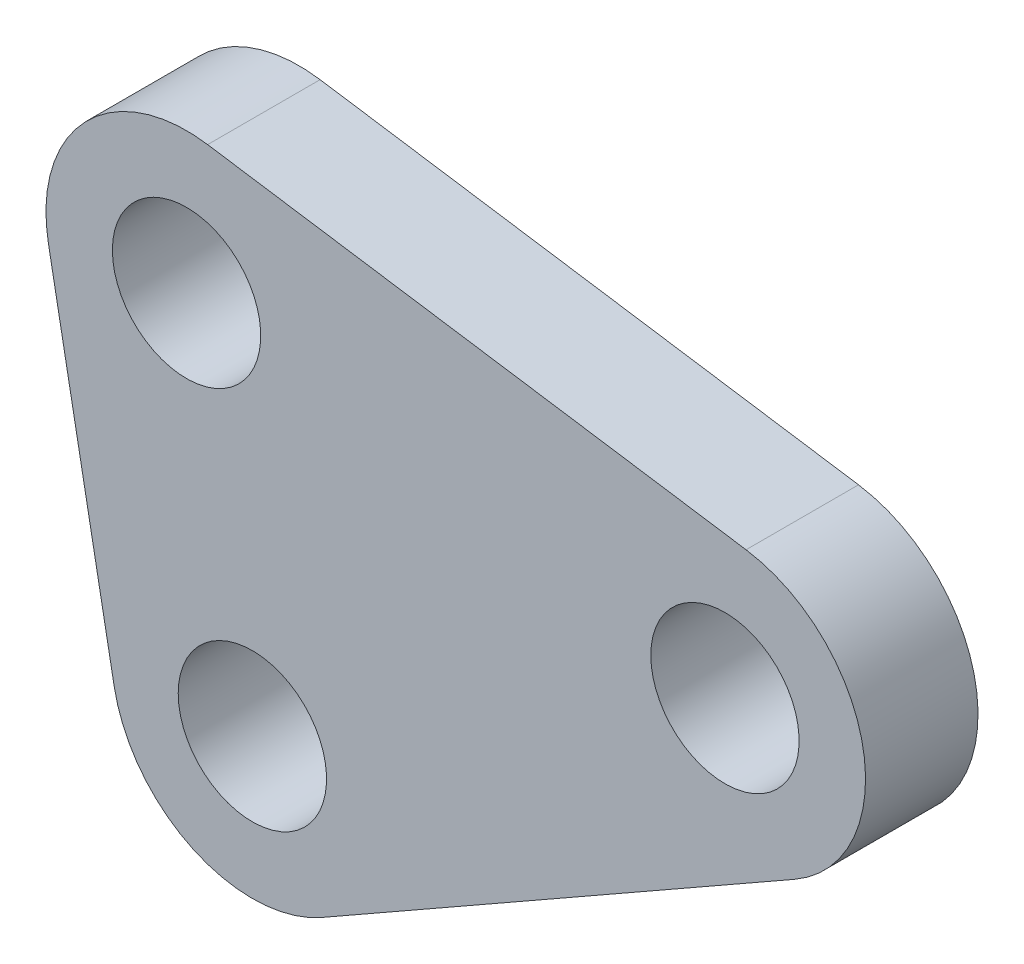
ISO-10303-21;
HEADER;
FILE_DESCRIPTION(('STEP AP214'),'2;1');
FILE_NAME('part.step','',(''),(''),'','','');
FILE_SCHEMA(('AUTOMOTIVE_DESIGN { 1 0 10303 214 1 1 1 1 }'));
ENDSEC;
DATA;
#1=APPLICATION_CONTEXT('core data for automotive mechanical design processes');
#2=APPLICATION_PROTOCOL_DEFINITION('international standard','automotive_design',2000,#1);
#3=PRODUCT_CONTEXT('',#1,'mechanical');
#4=PRODUCT('Part','Part','',(#3));
#5=PRODUCT_RELATED_PRODUCT_CATEGORY('part','',(#4));
#6=PRODUCT_DEFINITION_FORMATION('','',#4);
#7=PRODUCT_DEFINITION_CONTEXT('part definition',#1,'design');
#8=PRODUCT_DEFINITION('design','',#6,#7);
#9=PRODUCT_DEFINITION_SHAPE('','',#8);
#10=(LENGTH_UNIT() NAMED_UNIT(*) SI_UNIT(.MILLI.,.METRE.));
#11=(NAMED_UNIT(*) PLANE_ANGLE_UNIT() SI_UNIT($,.RADIAN.));
#12=(NAMED_UNIT(*) SI_UNIT($,.STERADIAN.) SOLID_ANGLE_UNIT());
#13=UNCERTAINTY_MEASURE_WITH_UNIT(LENGTH_MEASURE(1.E-05),#10,'distance_accuracy_value','');
#14=(GEOMETRIC_REPRESENTATION_CONTEXT(3) GLOBAL_UNCERTAINTY_ASSIGNED_CONTEXT((#13)) GLOBAL_UNIT_ASSIGNED_CONTEXT((#10,
#11,#12)) REPRESENTATION_CONTEXT('',''));
#15=CARTESIAN_POINT('',(0.,0.,0.));
#16=DIRECTION('',(0.,0.,1.));
#17=DIRECTION('',(1.,0.,0.));
#18=AXIS2_PLACEMENT_3D('',#15,#16,#17);
#19=CARTESIAN_POINT('',(45.2881051723479,69.194775027858,0.));
#20=DIRECTION('',(0.,0.,1.));
#21=DIRECTION('',(1.,0.,0.));
#22=AXIS2_PLACEMENT_3D('',#19,#20,#21);
#23=CYLINDRICAL_SURFACE('',#22,5.00000000000001);
#24=CARTESIAN_POINT('',(45.2881051723479,69.194775027858,4.));
#25=DIRECTION('',(0.,0.,1.));
#26=DIRECTION('',(1.,0.,0.));
#27=AXIS2_PLACEMENT_3D('',#24,#25,#26);
#28=CIRCLE('',#27,5.00000000000001);
#29=CARTESIAN_POINT('',(47.7635886864171,64.8505856475972,4.));
#30=VERTEX_POINT('',#29);
#31=CARTESIAN_POINT('',(46.0379881850551,74.1382227586683,4.));
#32=VERTEX_POINT('',#31);
#33=EDGE_CURVE('E120',#30,#32,#28,.T.);
#34=ORIENTED_EDGE('',*,*,#33,.F.);
#35=DIRECTION('',(0.,0.,1.));
#36=VECTOR('',#35,1.);
#37=CARTESIAN_POINT('',(47.7635886864171,64.8505856475972,0.));
#38=LINE('',#37,#36);
#39=CARTESIAN_POINT('',(47.7635886864171,64.8505856475972,0.));
#40=VERTEX_POINT('',#39);
#41=EDGE_CURVE('E11',#40,#30,#38,.T.);
#42=ORIENTED_EDGE('',*,*,#41,.F.);
#43=CARTESIAN_POINT('',(45.2881051723479,69.194775027858,0.));
#44=DIRECTION('',(0.,0.,1.));
#45=DIRECTION('',(1.,0.,0.));
#46=AXIS2_PLACEMENT_3D('',#43,#44,#45);
#47=CIRCLE('',#46,5.00000000000001);
#48=CARTESIAN_POINT('',(46.0379881850551,74.1382227586683,0.));
#49=VERTEX_POINT('',#48);
#50=EDGE_CURVE('E135',#40,#49,#47,.T.);
#51=ORIENTED_EDGE('',*,*,#50,.T.);
#52=DIRECTION('',(0.,0.,1.));
#53=VECTOR('',#52,1.);
#54=CARTESIAN_POINT('',(46.0379881850551,74.1382227586683,0.));
#55=LINE('',#54,#53);
#56=EDGE_CURVE('E38',#49,#32,#55,.T.);
#57=ORIENTED_EDGE('',*,*,#56,.T.);
#58=EDGE_LOOP('',(#34,#42,#51,#57));
#59=FACE_BOUND('',#58,.T.);
#60=ADVANCED_FACE('F35',(#59),#23,.T.);
#61=CARTESIAN_POINT('',(30.9580435209812,55.2741500089913,0.));
#62=DIRECTION('',(0.495096702813856,-0.868837876052171,0.));
#63=DIRECTION('',(0.868837876052171,0.495096702813856,0.));
#64=AXIS2_PLACEMENT_3D('',#61,#62,#63);
#65=PLANE('',#64);
#66=DIRECTION('',(0.868837876052171,0.495096702813856,0.));
#67=VECTOR('',#66,1.);
#68=CARTESIAN_POINT('',(30.9580435209812,55.2741500089913,4.));
#69=LINE('',#68,#67);
#70=CARTESIAN_POINT('',(30.9580435209812,55.2741500089913,4.));
#71=VERTEX_POINT('',#70);
#72=EDGE_CURVE('E133',#71,#30,#69,.T.);
#73=ORIENTED_EDGE('',*,*,#72,.F.);
#74=DIRECTION('',(0.,0.,1.));
#75=VECTOR('',#74,1.);
#76=CARTESIAN_POINT('',(30.9580435209812,55.2741500089913,0.));
#77=LINE('',#76,#75);
#78=CARTESIAN_POINT('',(30.9580435209812,55.2741500089913,0.));
#79=VERTEX_POINT('',#78);
#80=EDGE_CURVE('E44',#79,#71,#77,.T.);
#81=ORIENTED_EDGE('',*,*,#80,.F.);
#82=DIRECTION('',(0.868837876052171,0.495096702813856,0.));
#83=VECTOR('',#82,1.);
#84=CARTESIAN_POINT('',(30.9580435209812,55.2741500089913,0.));
#85=LINE('',#84,#83);
#86=EDGE_CURVE('E110',#79,#40,#85,.T.);
#87=ORIENTED_EDGE('',*,*,#86,.T.);
#88=ORIENTED_EDGE('',*,*,#41,.T.);
#89=EDGE_LOOP('',(#73,#81,#87,#88));
#90=FACE_BOUND('',#89,.T.);
#91=ADVANCED_FACE('F143',(#90),#65,.T.);
#92=CARTESIAN_POINT('',(28.4825600069119,59.6183393892521,0.));
#93=DIRECTION('',(0.,0.,1.));
#94=DIRECTION('',(1.,0.,0.));
#95=AXIS2_PLACEMENT_3D('',#92,#93,#94);
#96=CYLINDRICAL_SURFACE('',#95,4.99999999999993);
#97=CARTESIAN_POINT('',(28.4825600069119,59.6183393892521,4.));
#98=DIRECTION('',(0.,0.,1.));
#99=DIRECTION('',(1.,0.,0.));
#100=AXIS2_PLACEMENT_3D('',#97,#98,#99);
#101=CIRCLE('',#100,4.99999999999993);
#102=CARTESIAN_POINT('',(23.5682492589573,58.6966290917417,4.));
#103=VERTEX_POINT('',#102);
#104=EDGE_CURVE('E97',#103,#71,#101,.T.);
#105=ORIENTED_EDGE('',*,*,#104,.F.);
#106=DIRECTION('',(0.,0.,1.));
#107=VECTOR('',#106,1.);
#108=CARTESIAN_POINT('',(23.5682492589573,58.6966290917417,0.));
#109=LINE('',#108,#107);
#110=CARTESIAN_POINT('',(23.5682492589573,58.6966290917417,0.));
#111=VERTEX_POINT('',#110);
#112=EDGE_CURVE('E92',#111,#103,#109,.T.);
#113=ORIENTED_EDGE('',*,*,#112,.F.);
#114=CARTESIAN_POINT('',(28.4825600069119,59.6183393892521,0.));
#115=DIRECTION('',(0.,0.,1.));
#116=DIRECTION('',(1.,0.,0.));
#117=AXIS2_PLACEMENT_3D('',#114,#115,#116);
#118=CIRCLE('',#117,4.99999999999993);
#119=EDGE_CURVE('E95',#111,#79,#118,.T.);
#120=ORIENTED_EDGE('',*,*,#119,.T.);
#121=ORIENTED_EDGE('',*,*,#80,.T.);
#122=EDGE_LOOP('',(#105,#113,#120,#121));
#123=FACE_BOUND('',#122,.T.);
#124=ADVANCED_FACE('F94',(#123),#96,.T.);
#125=CARTESIAN_POINT('',(21.227396240506,71.1774261263712,0.));
#126=DIRECTION('',(-0.982862149590939,-0.184342059502107,0.));
#127=DIRECTION('',(0.184342059502107,-0.982862149590939,0.));
#128=AXIS2_PLACEMENT_3D('',#125,#126,#127);
#129=PLANE('',#128);
#130=DIRECTION('',(0.184342059502107,-0.982862149590939,0.));
#131=VECTOR('',#130,1.);
#132=CARTESIAN_POINT('',(21.227396240506,71.1774261263712,4.));
#133=LINE('',#132,#131);
#134=CARTESIAN_POINT('',(21.227396240506,71.1774261263712,4.));
#135=VERTEX_POINT('',#134);
#136=EDGE_CURVE('E130',#135,#103,#133,.T.);
#137=ORIENTED_EDGE('',*,*,#136,.F.);
#138=DIRECTION('',(0.,0.,1.));
#139=VECTOR('',#138,1.);
#140=CARTESIAN_POINT('',(21.227396240506,71.1774261263712,0.));
#141=LINE('',#140,#139);
#142=CARTESIAN_POINT('',(21.227396240506,71.1774261263712,0.));
#143=VERTEX_POINT('',#142);
#144=EDGE_CURVE('E102',#143,#135,#141,.T.);
#145=ORIENTED_EDGE('',*,*,#144,.F.);
#146=DIRECTION('',(0.184342059502107,-0.982862149590939,0.));
#147=VECTOR('',#146,1.);
#148=CARTESIAN_POINT('',(21.227396240506,71.1774261263712,0.));
#149=LINE('',#148,#147);
#150=EDGE_CURVE('E108',#143,#111,#149,.T.);
#151=ORIENTED_EDGE('',*,*,#150,.T.);
#152=ORIENTED_EDGE('',*,*,#112,.T.);
#153=EDGE_LOOP('',(#137,#145,#151,#152));
#154=FACE_BOUND('',#153,.T.);
#155=ADVANCED_FACE('F112',(#154),#129,.T.);
#156=CARTESIAN_POINT('',(26.1417069884607,72.0991364238817,0.));
#157=DIRECTION('',(0.,0.,1.));
#158=DIRECTION('',(1.,0.,0.));
#159=AXIS2_PLACEMENT_3D('',#156,#157,#158);
#160=CYLINDRICAL_SURFACE('',#159,5.);
#161=CARTESIAN_POINT('',(26.1417069884607,72.0991364238817,4.));
#162=DIRECTION('',(0.,0.,1.));
#163=DIRECTION('',(1.,0.,0.));
#164=AXIS2_PLACEMENT_3D('',#161,#162,#163);
#165=CIRCLE('',#164,5.);
#166=CARTESIAN_POINT('',(26.891590001168,77.042584154692,4.));
#167=VERTEX_POINT('',#166);
#168=EDGE_CURVE('E127',#167,#135,#165,.T.);
#169=ORIENTED_EDGE('',*,*,#168,.F.);
#170=DIRECTION('',(0.,0.,1.));
#171=VECTOR('',#170,1.);
#172=CARTESIAN_POINT('',(26.891590001168,77.042584154692,0.));
#173=LINE('',#172,#171);
#174=CARTESIAN_POINT('',(26.891590001168,77.042584154692,0.));
#175=VERTEX_POINT('',#174);
#176=EDGE_CURVE('E138',#175,#167,#173,.T.);
#177=ORIENTED_EDGE('',*,*,#176,.F.);
#178=CARTESIAN_POINT('',(26.1417069884607,72.0991364238817,0.));
#179=DIRECTION('',(0.,0.,1.));
#180=DIRECTION('',(1.,0.,0.));
#181=AXIS2_PLACEMENT_3D('',#178,#179,#180);
#182=CIRCLE('',#181,5.);
#183=EDGE_CURVE('E113',#175,#143,#182,.T.);
#184=ORIENTED_EDGE('',*,*,#183,.T.);
#185=ORIENTED_EDGE('',*,*,#144,.T.);
#186=EDGE_LOOP('',(#169,#177,#184,#185));
#187=FACE_BOUND('',#186,.T.);
#188=ADVANCED_FACE('F156',(#187),#160,.T.);
#189=CARTESIAN_POINT('',(46.0379881850551,74.1382227586683,0.));
#190=DIRECTION('',(0.14997660254145,0.988689546162052,0.));
#191=DIRECTION('',(-0.988689546162052,0.14997660254145,0.));
#192=AXIS2_PLACEMENT_3D('',#189,#190,#191);
#193=PLANE('',#192);
#194=DIRECTION('',(-0.988689546162052,0.14997660254145,0.));
#195=VECTOR('',#194,1.);
#196=CARTESIAN_POINT('',(46.0379881850551,74.1382227586683,4.));
#197=LINE('',#196,#195);
#198=EDGE_CURVE('E123',#32,#167,#197,.T.);
#199=ORIENTED_EDGE('',*,*,#198,.F.);
#200=ORIENTED_EDGE('',*,*,#56,.F.);
#201=DIRECTION('',(-0.988689546162052,0.14997660254145,0.));
#202=VECTOR('',#201,1.);
#203=CARTESIAN_POINT('',(46.0379881850551,74.1382227586683,0.));
#204=LINE('',#203,#202);
#205=EDGE_CURVE('E115',#49,#175,#204,.T.);
#206=ORIENTED_EDGE('',*,*,#205,.T.);
#207=ORIENTED_EDGE('',*,*,#176,.T.);
#208=EDGE_LOOP('',(#199,#200,#206,#207));
#209=FACE_BOUND('',#208,.T.);
#210=ADVANCED_FACE('F140',(#209),#193,.T.);
#211=CARTESIAN_POINT('',(45.2881051723479,69.194775027858,0.));
#212=DIRECTION('',(0.,0.,1.));
#213=DIRECTION('',(1.,0.,0.));
#214=AXIS2_PLACEMENT_3D('',#211,#212,#213);
#215=PLANE('',#214);
#216=CARTESIAN_POINT('',(28.4825600069119,59.6183393892521,0.));
#217=DIRECTION('',(0.,0.,1.));
#218=DIRECTION('',(-1.,0.,0.));
#219=AXIS2_PLACEMENT_3D('',#216,#217,#218);
#220=CIRCLE('',#219,2.6375);
#221=CARTESIAN_POINT('',(25.8450600069119,59.6183393892521,0.));
#222=VERTEX_POINT('',#221);
#223=EDGE_CURVE('E186',#222,#222,#220,.T.);
#224=ORIENTED_EDGE('',*,*,#223,.T.);
#225=EDGE_LOOP('',(#224));
#226=FACE_BOUND('',#225,.T.);
#227=CARTESIAN_POINT('',(26.1417069884607,72.0991364238817,0.));
#228=DIRECTION('',(0.,0.,1.));
#229=DIRECTION('',(-1.,0.,0.));
#230=AXIS2_PLACEMENT_3D('',#227,#228,#229);
#231=CIRCLE('',#230,2.6375);
#232=CARTESIAN_POINT('',(23.5042069884607,72.0991364238817,0.));
#233=VERTEX_POINT('',#232);
#234=EDGE_CURVE('E194',#233,#233,#231,.T.);
#235=ORIENTED_EDGE('',*,*,#234,.T.);
#236=EDGE_LOOP('',(#235));
#237=FACE_BOUND('',#236,.T.);
#238=CARTESIAN_POINT('',(45.2881051723479,69.194775027858,0.));
#239=DIRECTION('',(0.,0.,1.));
#240=DIRECTION('',(-1.,0.,0.));
#241=AXIS2_PLACEMENT_3D('',#238,#239,#240);
#242=CIRCLE('',#241,2.6375);
#243=CARTESIAN_POINT('',(42.6506051723479,69.194775027858,0.));
#244=VERTEX_POINT('',#243);
#245=EDGE_CURVE('E124',#244,#244,#242,.T.);
#246=ORIENTED_EDGE('',*,*,#245,.T.);
#247=EDGE_LOOP('',(#246));
#248=FACE_BOUND('',#247,.T.);
#249=ORIENTED_EDGE('',*,*,#50,.F.);
#250=ORIENTED_EDGE('',*,*,#86,.F.);
#251=ORIENTED_EDGE('',*,*,#119,.F.);
#252=ORIENTED_EDGE('',*,*,#150,.F.);
#253=ORIENTED_EDGE('',*,*,#183,.F.);
#254=ORIENTED_EDGE('',*,*,#205,.F.);
#255=EDGE_LOOP('',(#249,#250,#251,#252,#253,#254));
#256=FACE_BOUND('',#255,.T.);
#257=ADVANCED_FACE('F106',(#226,#237,#248,#256),#215,.F.);
#258=CARTESIAN_POINT('',(45.2881051723479,69.194775027858,4.));
#259=DIRECTION('',(0.,0.,1.));
#260=DIRECTION('',(1.,0.,0.));
#261=AXIS2_PLACEMENT_3D('',#258,#259,#260);
#262=PLANE('',#261);
#263=CARTESIAN_POINT('',(28.4825600069119,59.6183393892521,4.));
#264=DIRECTION('',(0.,0.,1.));
#265=DIRECTION('',(-1.,0.,0.));
#266=AXIS2_PLACEMENT_3D('',#263,#264,#265);
#267=CIRCLE('',#266,2.6375);
#268=CARTESIAN_POINT('',(25.8450600069119,59.6183393892521,4.));
#269=VERTEX_POINT('',#268);
#270=EDGE_CURVE('E189',#269,#269,#267,.T.);
#271=ORIENTED_EDGE('',*,*,#270,.F.);
#272=EDGE_LOOP('',(#271));
#273=FACE_BOUND('',#272,.T.);
#274=CARTESIAN_POINT('',(26.1417069884607,72.0991364238817,4.));
#275=DIRECTION('',(0.,0.,1.));
#276=DIRECTION('',(-1.,0.,0.));
#277=AXIS2_PLACEMENT_3D('',#274,#275,#276);
#278=CIRCLE('',#277,2.6375);
#279=CARTESIAN_POINT('',(23.5042069884607,72.0991364238817,4.));
#280=VERTEX_POINT('',#279);
#281=EDGE_CURVE('E191',#280,#280,#278,.T.);
#282=ORIENTED_EDGE('',*,*,#281,.F.);
#283=EDGE_LOOP('',(#282));
#284=FACE_BOUND('',#283,.T.);
#285=CARTESIAN_POINT('',(45.2881051723479,69.194775027858,4.));
#286=DIRECTION('',(0.,0.,1.));
#287=DIRECTION('',(-1.,0.,0.));
#288=AXIS2_PLACEMENT_3D('',#285,#286,#287);
#289=CIRCLE('',#288,2.6375);
#290=CARTESIAN_POINT('',(42.6506051723479,69.194775027858,4.));
#291=VERTEX_POINT('',#290);
#292=EDGE_CURVE('E197',#291,#291,#289,.T.);
#293=ORIENTED_EDGE('',*,*,#292,.F.);
#294=EDGE_LOOP('',(#293));
#295=FACE_BOUND('',#294,.T.);
#296=ORIENTED_EDGE('',*,*,#33,.T.);
#297=ORIENTED_EDGE('',*,*,#198,.T.);
#298=ORIENTED_EDGE('',*,*,#168,.T.);
#299=ORIENTED_EDGE('',*,*,#136,.T.);
#300=ORIENTED_EDGE('',*,*,#104,.T.);
#301=ORIENTED_EDGE('',*,*,#72,.T.);
#302=EDGE_LOOP('',(#296,#297,#298,#299,#300,#301));
#303=FACE_BOUND('',#302,.T.);
#304=ADVANCED_FACE('F142',(#273,#284,#295,#303),#262,.T.);
#305=CARTESIAN_POINT('',(45.2881051723479,69.194775027858,0.));
#306=DIRECTION('',(0.,0.,1.));
#307=DIRECTION('',(1.,0.,0.));
#308=AXIS2_PLACEMENT_3D('',#305,#306,#307);
#309=CYLINDRICAL_SURFACE('',#308,2.6375);
#310=ORIENTED_EDGE('',*,*,#245,.F.);
#311=EDGE_LOOP('',(#310));
#312=FACE_BOUND('',#311,.T.);
#313=ORIENTED_EDGE('',*,*,#292,.T.);
#314=EDGE_LOOP('',(#313));
#315=FACE_BOUND('',#314,.T.);
#316=ADVANCED_FACE('F167',(#312,#315),#309,.F.);
#317=CARTESIAN_POINT('',(26.1417069884607,72.0991364238817,0.));
#318=DIRECTION('',(0.,0.,1.));
#319=DIRECTION('',(1.,0.,0.));
#320=AXIS2_PLACEMENT_3D('',#317,#318,#319);
#321=CYLINDRICAL_SURFACE('',#320,2.6375);
#322=ORIENTED_EDGE('',*,*,#234,.F.);
#323=EDGE_LOOP('',(#322));
#324=FACE_BOUND('',#323,.T.);
#325=ORIENTED_EDGE('',*,*,#281,.T.);
#326=EDGE_LOOP('',(#325));
#327=FACE_BOUND('',#326,.T.);
#328=ADVANCED_FACE('F174',(#324,#327),#321,.F.);
#329=CARTESIAN_POINT('',(28.4825600069119,59.6183393892521,0.));
#330=DIRECTION('',(0.,0.,1.));
#331=DIRECTION('',(1.,0.,0.));
#332=AXIS2_PLACEMENT_3D('',#329,#330,#331);
#333=CYLINDRICAL_SURFACE('',#332,2.6375);
#334=ORIENTED_EDGE('',*,*,#223,.F.);
#335=EDGE_LOOP('',(#334));
#336=FACE_BOUND('',#335,.T.);
#337=ORIENTED_EDGE('',*,*,#270,.T.);
#338=EDGE_LOOP('',(#337));
#339=FACE_BOUND('',#338,.T.);
#340=ADVANCED_FACE('F178',(#336,#339),#333,.F.);
#341=CLOSED_SHELL('',(#60,#91,#124,#155,#188,#210,#257,#304,#316,#328,#340));
#342=MANIFOLD_SOLID_BREP('B2',#341);
#343=ADVANCED_BREP_SHAPE_REPRESENTATION('',(#18,#342),#14);
#344=SHAPE_DEFINITION_REPRESENTATION(#9,#343);
ENDSEC;
END-ISO-10303-21;
